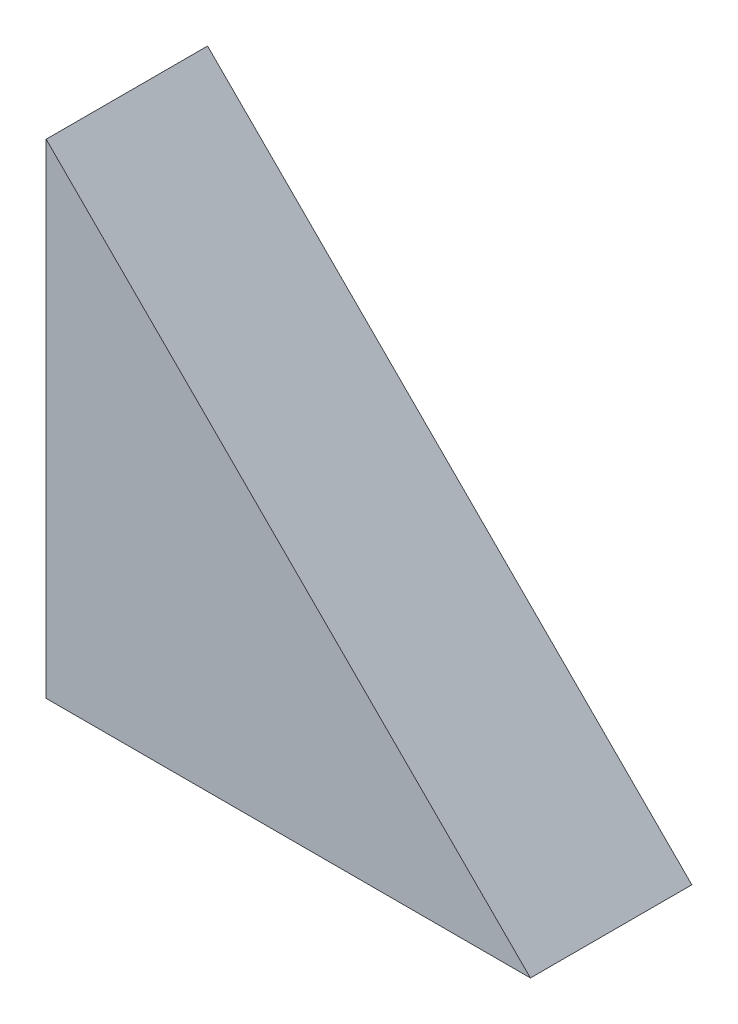
ISO-10303-21;
HEADER;
FILE_DESCRIPTION(('STEP AP214'),'2;1');
FILE_NAME('part.step','',(''),(''),'','','');
FILE_SCHEMA(('AUTOMOTIVE_DESIGN { 1 0 10303 214 1 1 1 1 }'));
ENDSEC;
DATA;
#1=APPLICATION_CONTEXT('core data for automotive mechanical design processes');
#2=APPLICATION_PROTOCOL_DEFINITION('international standard','automotive_design',2000,#1);
#3=PRODUCT_CONTEXT('',#1,'mechanical');
#4=PRODUCT('Part','Part','',(#3));
#5=PRODUCT_RELATED_PRODUCT_CATEGORY('part','',(#4));
#6=PRODUCT_DEFINITION_FORMATION('','',#4);
#7=PRODUCT_DEFINITION_CONTEXT('part definition',#1,'design');
#8=PRODUCT_DEFINITION('design','',#6,#7);
#9=PRODUCT_DEFINITION_SHAPE('','',#8);
#10=(LENGTH_UNIT() NAMED_UNIT(*) SI_UNIT(.MILLI.,.METRE.));
#11=(NAMED_UNIT(*) PLANE_ANGLE_UNIT() SI_UNIT($,.RADIAN.));
#12=(NAMED_UNIT(*) SI_UNIT($,.STERADIAN.) SOLID_ANGLE_UNIT());
#13=UNCERTAINTY_MEASURE_WITH_UNIT(LENGTH_MEASURE(1.E-05),#10,'distance_accuracy_value','');
#14=(GEOMETRIC_REPRESENTATION_CONTEXT(3) GLOBAL_UNCERTAINTY_ASSIGNED_CONTEXT((#13)) GLOBAL_UNIT_ASSIGNED_CONTEXT((#10,
#11,#12)) REPRESENTATION_CONTEXT('',''));
#15=CARTESIAN_POINT('',(0.,0.,0.));
#16=DIRECTION('',(0.,0.,1.));
#17=DIRECTION('',(1.,0.,0.));
#18=AXIS2_PLACEMENT_3D('',#15,#16,#17);
#19=CARTESIAN_POINT('',(38.1,0.,6.35));
#20=DIRECTION('',(-0.707106781186543,-0.707106781186551,0.));
#21=DIRECTION('',(0.707106781186551,-0.707106781186544,0.));
#22=AXIS2_PLACEMENT_3D('',#19,#20,#21);
#23=PLANE('',#22);
#24=DIRECTION('',(-0.707106781186551,0.707106781186544,0.));
#25=VECTOR('',#24,1.);
#26=CARTESIAN_POINT('',(38.1,0.,-6.35));
#27=LINE('',#26,#25);
#28=CARTESIAN_POINT('',(38.1,0.,-6.35));
#29=VERTEX_POINT('',#28);
#30=CARTESIAN_POINT('',(0.,38.0999999999996,-6.35));
#31=VERTEX_POINT('',#30);
#32=EDGE_CURVE('E80',#29,#31,#27,.T.);
#33=ORIENTED_EDGE('',*,*,#32,.T.);
#34=DIRECTION('',(0.,0.,-1.));
#35=VECTOR('',#34,1.);
#36=CARTESIAN_POINT('',(0.,38.0999999999996,6.35));
#37=LINE('',#36,#35);
#38=CARTESIAN_POINT('',(0.,38.0999999999996,6.35));
#39=VERTEX_POINT('',#38);
#40=EDGE_CURVE('E11',#39,#31,#37,.T.);
#41=ORIENTED_EDGE('',*,*,#40,.F.);
#42=DIRECTION('',(-0.707106781186551,0.707106781186544,0.));
#43=VECTOR('',#42,1.);
#44=CARTESIAN_POINT('',(38.1,0.,6.35));
#45=LINE('',#44,#43);
#46=CARTESIAN_POINT('',(38.1,0.,6.35));
#47=VERTEX_POINT('',#46);
#48=EDGE_CURVE('E73',#47,#39,#45,.T.);
#49=ORIENTED_EDGE('',*,*,#48,.F.);
#50=DIRECTION('',(0.,0.,-1.));
#51=VECTOR('',#50,1.);
#52=CARTESIAN_POINT('',(38.1,0.,6.35));
#53=LINE('',#52,#51);
#54=EDGE_CURVE('E81',#47,#29,#53,.T.);
#55=ORIENTED_EDGE('',*,*,#54,.T.);
#56=EDGE_LOOP('',(#33,#41,#49,#55));
#57=FACE_BOUND('',#56,.T.);
#58=ADVANCED_FACE('F33',(#57),#23,.F.);
#59=CARTESIAN_POINT('',(0.,38.0999999999996,6.35));
#60=DIRECTION('',(1.,0.,0.));
#61=DIRECTION('',(0.,0.,-1.));
#62=AXIS2_PLACEMENT_3D('',#59,#60,#61);
#63=PLANE('',#62);
#64=DIRECTION('',(0.,-1.,0.));
#65=VECTOR('',#64,1.);
#66=CARTESIAN_POINT('',(0.,38.0999999999996,-6.35));
#67=LINE('',#66,#65);
#68=CARTESIAN_POINT('',(0.,0.,-6.35));
#69=VERTEX_POINT('',#68);
#70=EDGE_CURVE('E61',#31,#69,#67,.T.);
#71=ORIENTED_EDGE('',*,*,#70,.T.);
#72=DIRECTION('',(0.,0.,-1.));
#73=VECTOR('',#72,1.);
#74=CARTESIAN_POINT('',(0.,0.,6.35));
#75=LINE('',#74,#73);
#76=CARTESIAN_POINT('',(0.,0.,6.35));
#77=VERTEX_POINT('',#76);
#78=EDGE_CURVE('E41',#77,#69,#75,.T.);
#79=ORIENTED_EDGE('',*,*,#78,.F.);
#80=DIRECTION('',(0.,-1.,0.));
#81=VECTOR('',#80,1.);
#82=CARTESIAN_POINT('',(0.,38.0999999999996,6.35));
#83=LINE('',#82,#81);
#84=EDGE_CURVE('E69',#39,#77,#83,.T.);
#85=ORIENTED_EDGE('',*,*,#84,.F.);
#86=ORIENTED_EDGE('',*,*,#40,.T.);
#87=EDGE_LOOP('',(#71,#79,#85,#86));
#88=FACE_BOUND('',#87,.T.);
#89=ADVANCED_FACE('F70',(#88),#63,.F.);
#90=CARTESIAN_POINT('',(0.,0.,6.35));
#91=DIRECTION('',(0.,1.,0.));
#92=DIRECTION('',(0.,0.,1.));
#93=AXIS2_PLACEMENT_3D('',#90,#91,#92);
#94=PLANE('',#93);
#95=DIRECTION('',(1.,0.,0.));
#96=VECTOR('',#95,1.);
#97=CARTESIAN_POINT('',(0.,0.,-6.35));
#98=LINE('',#97,#96);
#99=EDGE_CURVE('E66',#69,#29,#98,.T.);
#100=ORIENTED_EDGE('',*,*,#99,.T.);
#101=ORIENTED_EDGE('',*,*,#54,.F.);
#102=DIRECTION('',(1.,0.,0.));
#103=VECTOR('',#102,1.);
#104=CARTESIAN_POINT('',(0.,0.,6.35));
#105=LINE('',#104,#103);
#106=EDGE_CURVE('E49',#77,#47,#105,.T.);
#107=ORIENTED_EDGE('',*,*,#106,.F.);
#108=ORIENTED_EDGE('',*,*,#78,.T.);
#109=EDGE_LOOP('',(#100,#101,#107,#108));
#110=FACE_BOUND('',#109,.T.);
#111=ADVANCED_FACE('F88',(#110),#94,.F.);
#112=CARTESIAN_POINT('',(0.,0.,6.35));
#113=DIRECTION('',(0.,0.,1.));
#114=DIRECTION('',(1.,0.,0.));
#115=AXIS2_PLACEMENT_3D('',#112,#113,#114);
#116=PLANE('',#115);
#117=ORIENTED_EDGE('',*,*,#48,.T.);
#118=ORIENTED_EDGE('',*,*,#84,.T.);
#119=ORIENTED_EDGE('',*,*,#106,.T.);
#120=EDGE_LOOP('',(#117,#118,#119));
#121=FACE_BOUND('',#120,.T.);
#122=ADVANCED_FACE('F76',(#121),#116,.T.);
#123=CARTESIAN_POINT('',(0.,0.,-6.35));
#124=DIRECTION('',(0.,0.,1.));
#125=DIRECTION('',(1.,0.,0.));
#126=AXIS2_PLACEMENT_3D('',#123,#124,#125);
#127=PLANE('',#126);
#128=ORIENTED_EDGE('',*,*,#32,.F.);
#129=ORIENTED_EDGE('',*,*,#99,.F.);
#130=ORIENTED_EDGE('',*,*,#70,.F.);
#131=EDGE_LOOP('',(#128,#129,#130));
#132=FACE_BOUND('',#131,.T.);
#133=ADVANCED_FACE('F89',(#132),#127,.F.);
#134=CLOSED_SHELL('',(#58,#89,#111,#122,#133));
#135=MANIFOLD_SOLID_BREP('B2',#134);
#136=ADVANCED_BREP_SHAPE_REPRESENTATION('',(#18,#135),#14);
#137=SHAPE_DEFINITION_REPRESENTATION(#9,#136);
ENDSEC;
END-ISO-10303-21;
